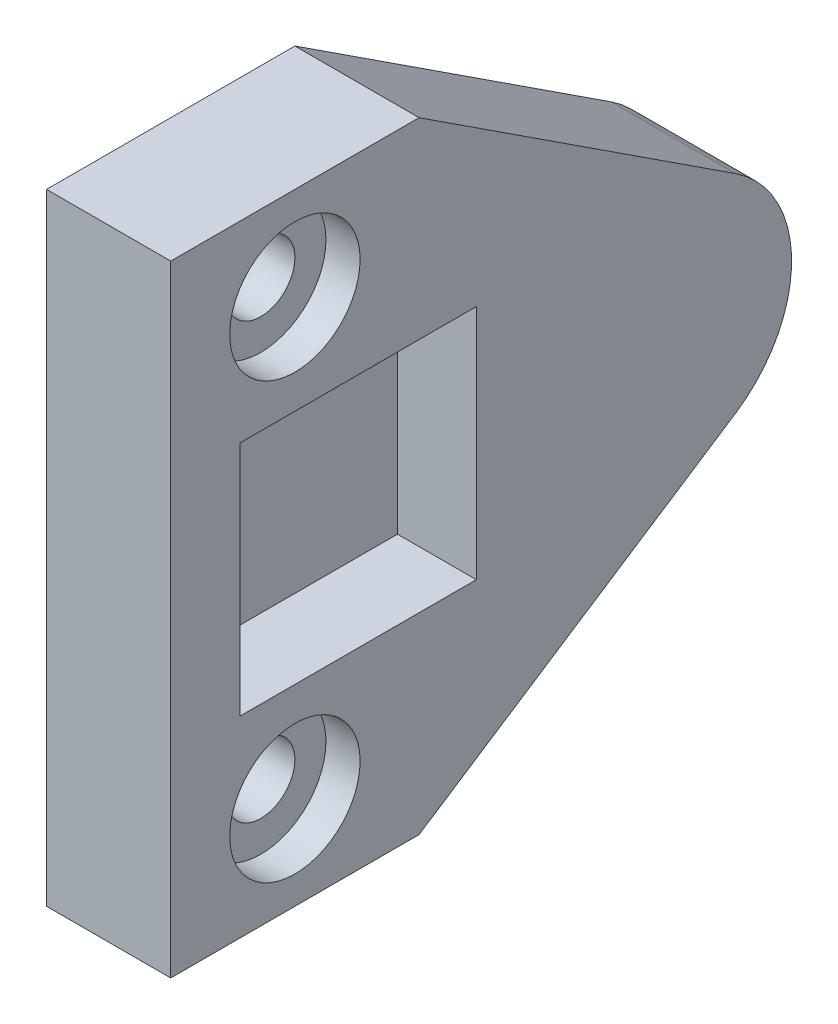
ISO-10303-21;
HEADER;
FILE_DESCRIPTION(('STEP AP214'),'2;1');
FILE_NAME('part.step','',(''),(''),'','','');
FILE_SCHEMA(('AUTOMOTIVE_DESIGN { 1 0 10303 214 1 1 1 1 }'));
ENDSEC;
DATA;
#1=APPLICATION_CONTEXT('core data for automotive mechanical design processes');
#2=APPLICATION_PROTOCOL_DEFINITION('international standard','automotive_design',2000,#1);
#3=PRODUCT_CONTEXT('',#1,'mechanical');
#4=PRODUCT('Part','Part','',(#3));
#5=PRODUCT_RELATED_PRODUCT_CATEGORY('part','',(#4));
#6=PRODUCT_DEFINITION_FORMATION('','',#4);
#7=PRODUCT_DEFINITION_CONTEXT('part definition',#1,'design');
#8=PRODUCT_DEFINITION('design','',#6,#7);
#9=PRODUCT_DEFINITION_SHAPE('','',#8);
#10=(LENGTH_UNIT() NAMED_UNIT(*) SI_UNIT(.MILLI.,.METRE.));
#11=(NAMED_UNIT(*) PLANE_ANGLE_UNIT() SI_UNIT($,.RADIAN.));
#12=(NAMED_UNIT(*) SI_UNIT($,.STERADIAN.) SOLID_ANGLE_UNIT());
#13=UNCERTAINTY_MEASURE_WITH_UNIT(LENGTH_MEASURE(1.E-05),#10,'distance_accuracy_value','');
#14=(GEOMETRIC_REPRESENTATION_CONTEXT(3) GLOBAL_UNCERTAINTY_ASSIGNED_CONTEXT((#13)) GLOBAL_UNIT_ASSIGNED_CONTEXT((#10,
#11,#12)) REPRESENTATION_CONTEXT('',''));
#15=CARTESIAN_POINT('',(0.,0.,0.));
#16=DIRECTION('',(0.,0.,1.));
#17=DIRECTION('',(1.,0.,0.));
#18=AXIS2_PLACEMENT_3D('',#15,#16,#17);
#19=CARTESIAN_POINT('',(10.,-25.,0.));
#20=DIRECTION('',(0.,1.,0.));
#21=DIRECTION('',(0.,0.,1.));
#22=AXIS2_PLACEMENT_3D('',#19,#20,#21);
#23=PLANE('',#22);
#24=DIRECTION('',(0.,0.,-1.));
#25=VECTOR('',#24,1.);
#26=CARTESIAN_POINT('',(0.,-25.,0.));
#27=LINE('',#26,#25);
#28=CARTESIAN_POINT('',(0.,-25.,20.));
#29=VERTEX_POINT('',#28);
#30=CARTESIAN_POINT('',(0.,-25.,0.));
#31=VERTEX_POINT('',#30);
#32=EDGE_CURVE('E130',#29,#31,#27,.T.);
#33=ORIENTED_EDGE('',*,*,#32,.T.);
#34=DIRECTION('',(-1.,0.,0.));
#35=VECTOR('',#34,1.);
#36=CARTESIAN_POINT('',(10.,-25.,0.));
#37=LINE('',#36,#35);
#38=CARTESIAN_POINT('',(10.,-25.,0.));
#39=VERTEX_POINT('',#38);
#40=EDGE_CURVE('E11',#39,#31,#37,.T.);
#41=ORIENTED_EDGE('',*,*,#40,.F.);
#42=DIRECTION('',(0.,0.,-1.));
#43=VECTOR('',#42,1.);
#44=CARTESIAN_POINT('',(10.,-25.,0.));
#45=LINE('',#44,#43);
#46=CARTESIAN_POINT('',(10.,-25.,20.));
#47=VERTEX_POINT('',#46);
#48=EDGE_CURVE('E90',#47,#39,#45,.T.);
#49=ORIENTED_EDGE('',*,*,#48,.F.);
#50=DIRECTION('',(-1.,0.,0.));
#51=VECTOR('',#50,1.);
#52=CARTESIAN_POINT('',(10.,-25.,20.));
#53=LINE('',#52,#51);
#54=EDGE_CURVE('E58',#47,#29,#53,.T.);
#55=ORIENTED_EDGE('',*,*,#54,.T.);
#56=EDGE_LOOP('',(#33,#41,#49,#55));
#57=FACE_BOUND('',#56,.T.);
#58=ADVANCED_FACE('F35',(#57),#23,.F.);
#59=CARTESIAN_POINT('',(10.,-17.5285693400336,-11.4439281015076));
#60=DIRECTION('',(0.,-0.837342685882753,-0.546678357353442));
#61=DIRECTION('',(0.,0.546678357353442,-0.837342685882753));
#62=AXIS2_PLACEMENT_3D('',#59,#60,#61);
#63=PLANE('',#62);
#64=DIRECTION('',(0.,-0.546678357353442,0.837342685882753));
#65=VECTOR('',#64,1.);
#66=CARTESIAN_POINT('',(0.,-17.5285693400336,-11.4439281015076));
#67=LINE('',#66,#65);
#68=CARTESIAN_POINT('',(0.,-8.37342685882754,-25.4667835735344));
#69=VERTEX_POINT('',#68);
#70=EDGE_CURVE('E132',#69,#31,#67,.T.);
#71=ORIENTED_EDGE('',*,*,#70,.F.);
#72=DIRECTION('',(-1.,0.,0.));
#73=VECTOR('',#72,1.);
#74=CARTESIAN_POINT('',(10.,-8.37342685882754,-25.4667835735344));
#75=LINE('',#74,#73);
#76=CARTESIAN_POINT('',(10.,-8.37342685882754,-25.4667835735344));
#77=VERTEX_POINT('',#76);
#78=EDGE_CURVE('E42',#77,#69,#75,.T.);
#79=ORIENTED_EDGE('',*,*,#78,.F.);
#80=DIRECTION('',(0.,-0.546678357353442,0.837342685882753));
#81=VECTOR('',#80,1.);
#82=CARTESIAN_POINT('',(10.,-17.5285693400336,-11.4439281015076));
#83=LINE('',#82,#81);
#84=EDGE_CURVE('E171',#77,#39,#83,.T.);
#85=ORIENTED_EDGE('',*,*,#84,.T.);
#86=ORIENTED_EDGE('',*,*,#40,.T.);
#87=EDGE_LOOP('',(#71,#79,#85,#86));
#88=FACE_BOUND('',#87,.T.);
#89=ADVANCED_FACE('F153',(#88),#63,.T.);
#90=CARTESIAN_POINT('',(10.,0.,-20.));
#91=DIRECTION('',(-1.,0.,0.));
#92=DIRECTION('',(0.,0.,1.));
#93=AXIS2_PLACEMENT_3D('',#90,#91,#92);
#94=CYLINDRICAL_SURFACE('',#93,10.);
#95=CARTESIAN_POINT('',(0.,0.,-20.));
#96=DIRECTION('',(1.,0.,0.));
#97=DIRECTION('',(0.,0.,-1.));
#98=AXIS2_PLACEMENT_3D('',#95,#96,#97);
#99=CIRCLE('',#98,10.);
#100=CARTESIAN_POINT('',(0.,8.37342685882754,-25.4667835735344));
#101=VERTEX_POINT('',#100);
#102=EDGE_CURVE('E136',#101,#69,#99,.F.);
#103=ORIENTED_EDGE('',*,*,#102,.F.);
#104=DIRECTION('',(-1.,0.,0.));
#105=VECTOR('',#104,1.);
#106=CARTESIAN_POINT('',(10.,8.37342685882754,-25.4667835735344));
#107=LINE('',#106,#105);
#108=CARTESIAN_POINT('',(10.,8.37342685882754,-25.4667835735344));
#109=VERTEX_POINT('',#108);
#110=EDGE_CURVE('E114',#109,#101,#107,.T.);
#111=ORIENTED_EDGE('',*,*,#110,.F.);
#112=CARTESIAN_POINT('',(10.,0.,-20.));
#113=DIRECTION('',(1.,0.,0.));
#114=DIRECTION('',(0.,0.,-1.));
#115=AXIS2_PLACEMENT_3D('',#112,#113,#114);
#116=CIRCLE('',#115,10.);
#117=EDGE_CURVE('E122',#109,#77,#116,.F.);
#118=ORIENTED_EDGE('',*,*,#117,.T.);
#119=ORIENTED_EDGE('',*,*,#78,.T.);
#120=EDGE_LOOP('',(#103,#111,#118,#119));
#121=FACE_BOUND('',#120,.T.);
#122=ADVANCED_FACE('F150',(#121),#94,.T.);
#123=CARTESIAN_POINT('',(10.,17.5285693400336,-11.4439281015076));
#124=DIRECTION('',(0.,0.837342685882753,-0.546678357353442));
#125=DIRECTION('',(0.,0.546678357353442,0.837342685882753));
#126=AXIS2_PLACEMENT_3D('',#123,#124,#125);
#127=PLANE('',#126);
#128=DIRECTION('',(0.,-0.546678357353442,-0.837342685882753));
#129=VECTOR('',#128,1.);
#130=CARTESIAN_POINT('',(0.,17.5285693400336,-11.4439281015076));
#131=LINE('',#130,#129);
#132=CARTESIAN_POINT('',(0.,25.,0.));
#133=VERTEX_POINT('',#132);
#134=EDGE_CURVE('E109',#133,#101,#131,.T.);
#135=ORIENTED_EDGE('',*,*,#134,.F.);
#136=DIRECTION('',(-1.,0.,0.));
#137=VECTOR('',#136,1.);
#138=CARTESIAN_POINT('',(10.,25.,0.));
#139=LINE('',#138,#137);
#140=CARTESIAN_POINT('',(10.,25.,0.));
#141=VERTEX_POINT('',#140);
#142=EDGE_CURVE('E104',#141,#133,#139,.T.);
#143=ORIENTED_EDGE('',*,*,#142,.F.);
#144=DIRECTION('',(0.,-0.546678357353442,-0.837342685882753));
#145=VECTOR('',#144,1.);
#146=CARTESIAN_POINT('',(10.,17.5285693400336,-11.4439281015076));
#147=LINE('',#146,#145);
#148=EDGE_CURVE('E107',#141,#109,#147,.T.);
#149=ORIENTED_EDGE('',*,*,#148,.T.);
#150=ORIENTED_EDGE('',*,*,#110,.T.);
#151=EDGE_LOOP('',(#135,#143,#149,#150));
#152=FACE_BOUND('',#151,.T.);
#153=ADVANCED_FACE('F106',(#152),#127,.T.);
#154=CARTESIAN_POINT('',(10.,25.,0.));
#155=DIRECTION('',(0.,1.,0.));
#156=DIRECTION('',(0.,0.,1.));
#157=AXIS2_PLACEMENT_3D('',#154,#155,#156);
#158=PLANE('',#157);
#159=DIRECTION('',(0.,0.,-1.));
#160=VECTOR('',#159,1.);
#161=CARTESIAN_POINT('',(0.,25.,0.));
#162=LINE('',#161,#160);
#163=CARTESIAN_POINT('',(0.,25.,20.));
#164=VERTEX_POINT('',#163);
#165=EDGE_CURVE('E140',#164,#133,#162,.T.);
#166=ORIENTED_EDGE('',*,*,#165,.F.);
#167=DIRECTION('',(-1.,0.,0.));
#168=VECTOR('',#167,1.);
#169=CARTESIAN_POINT('',(10.,25.,20.));
#170=LINE('',#169,#168);
#171=CARTESIAN_POINT('',(10.,25.,20.));
#172=VERTEX_POINT('',#171);
#173=EDGE_CURVE('E115',#172,#164,#170,.T.);
#174=ORIENTED_EDGE('',*,*,#173,.F.);
#175=DIRECTION('',(0.,0.,-1.));
#176=VECTOR('',#175,1.);
#177=CARTESIAN_POINT('',(10.,25.,0.));
#178=LINE('',#177,#176);
#179=EDGE_CURVE('E120',#172,#141,#178,.T.);
#180=ORIENTED_EDGE('',*,*,#179,.T.);
#181=ORIENTED_EDGE('',*,*,#142,.T.);
#182=EDGE_LOOP('',(#166,#174,#180,#181));
#183=FACE_BOUND('',#182,.T.);
#184=ADVANCED_FACE('F124',(#183),#158,.T.);
#185=CARTESIAN_POINT('',(10.,0.,20.));
#186=DIRECTION('',(0.,0.,1.));
#187=DIRECTION('',(1.,0.,0.));
#188=AXIS2_PLACEMENT_3D('',#185,#186,#187);
#189=PLANE('',#188);
#190=DIRECTION('',(0.,1.,0.));
#191=VECTOR('',#190,1.);
#192=CARTESIAN_POINT('',(0.,0.,20.));
#193=LINE('',#192,#191);
#194=EDGE_CURVE('E142',#29,#164,#193,.T.);
#195=ORIENTED_EDGE('',*,*,#194,.F.);
#196=ORIENTED_EDGE('',*,*,#54,.F.);
#197=DIRECTION('',(0.,1.,0.));
#198=VECTOR('',#197,1.);
#199=CARTESIAN_POINT('',(10.,0.,20.));
#200=LINE('',#199,#198);
#201=EDGE_CURVE('E125',#47,#172,#200,.T.);
#202=ORIENTED_EDGE('',*,*,#201,.T.);
#203=ORIENTED_EDGE('',*,*,#173,.T.);
#204=EDGE_LOOP('',(#195,#196,#202,#203));
#205=FACE_BOUND('',#204,.T.);
#206=ADVANCED_FACE('F156',(#205),#189,.T.);
#207=CARTESIAN_POINT('',(10.,0.,0.));
#208=DIRECTION('',(1.,0.,0.));
#209=DIRECTION('',(0.,0.,-1.));
#210=AXIS2_PLACEMENT_3D('',#207,#208,#209);
#211=PLANE('',#210);
#212=DIRECTION('',(0.,-1.,0.));
#213=VECTOR('',#212,1.);
#214=CARTESIAN_POINT('',(10.,9.525,14.4405658787244));
#215=LINE('',#214,#213);
#216=CARTESIAN_POINT('',(10.,9.525,14.4405658787244));
#217=VERTEX_POINT('',#216);
#218=CARTESIAN_POINT('',(10.,-9.525,14.4405658787244));
#219=VERTEX_POINT('',#218);
#220=EDGE_CURVE('E49',#217,#219,#215,.T.);
#221=ORIENTED_EDGE('',*,*,#220,.F.);
#222=DIRECTION('',(0.,0.,1.));
#223=VECTOR('',#222,1.);
#224=CARTESIAN_POINT('',(10.,9.525,14.4405658787244));
#225=LINE('',#224,#223);
#226=CARTESIAN_POINT('',(10.,9.525,-4.6094341212756));
#227=VERTEX_POINT('',#226);
#228=EDGE_CURVE('E209',#227,#217,#225,.T.);
#229=ORIENTED_EDGE('',*,*,#228,.F.);
#230=DIRECTION('',(0.,1.,0.));
#231=VECTOR('',#230,1.);
#232=CARTESIAN_POINT('',(10.,9.525,-4.6094341212756));
#233=LINE('',#232,#231);
#234=CARTESIAN_POINT('',(10.,-9.525,-4.6094341212756));
#235=VERTEX_POINT('',#234);
#236=EDGE_CURVE('E213',#235,#227,#233,.T.);
#237=ORIENTED_EDGE('',*,*,#236,.F.);
#238=DIRECTION('',(0.,0.,-1.));
#239=VECTOR('',#238,1.);
#240=CARTESIAN_POINT('',(10.,-9.525,14.4405658787244));
#241=LINE('',#240,#239);
#242=EDGE_CURVE('E216',#219,#235,#241,.T.);
#243=ORIENTED_EDGE('',*,*,#242,.F.);
#244=EDGE_LOOP('',(#221,#229,#237,#243));
#245=FACE_BOUND('',#244,.T.);
#246=CARTESIAN_POINT('',(10.,17.5,9.99999999999999));
#247=DIRECTION('',(1.,0.,0.));
#248=DIRECTION('',(0.,0.,-1.));
#249=AXIS2_PLACEMENT_3D('',#246,#247,#248);
#250=CIRCLE('',#249,5.25);
#251=CARTESIAN_POINT('',(10.,17.5,4.74999999999999));
#252=VERTEX_POINT('',#251);
#253=EDGE_CURVE('E195',#252,#252,#250,.T.);
#254=ORIENTED_EDGE('',*,*,#253,.F.);
#255=EDGE_LOOP('',(#254));
#256=FACE_BOUND('',#255,.T.);
#257=CARTESIAN_POINT('',(10.,-17.5,9.99999999999999));
#258=DIRECTION('',(1.,0.,0.));
#259=DIRECTION('',(0.,0.,-1.));
#260=AXIS2_PLACEMENT_3D('',#257,#258,#259);
#261=CIRCLE('',#260,5.25);
#262=CARTESIAN_POINT('',(10.,-17.5,4.74999999999999));
#263=VERTEX_POINT('',#262);
#264=EDGE_CURVE('E183',#263,#263,#261,.T.);
#265=ORIENTED_EDGE('',*,*,#264,.F.);
#266=EDGE_LOOP('',(#265));
#267=FACE_BOUND('',#266,.T.);
#268=ORIENTED_EDGE('',*,*,#48,.T.);
#269=ORIENTED_EDGE('',*,*,#84,.F.);
#270=ORIENTED_EDGE('',*,*,#117,.F.);
#271=ORIENTED_EDGE('',*,*,#148,.F.);
#272=ORIENTED_EDGE('',*,*,#179,.F.);
#273=ORIENTED_EDGE('',*,*,#201,.F.);
#274=EDGE_LOOP('',(#268,#269,#270,#271,#272,#273));
#275=FACE_BOUND('',#274,.T.);
#276=ADVANCED_FACE('F119',(#245,#256,#267,#275),#211,.T.);
#277=CARTESIAN_POINT('',(0.,0.,0.));
#278=DIRECTION('',(1.,0.,0.));
#279=DIRECTION('',(0.,0.,-1.));
#280=AXIS2_PLACEMENT_3D('',#277,#278,#279);
#281=PLANE('',#280);
#282=CARTESIAN_POINT('',(0.,17.5,9.99999999999999));
#283=DIRECTION('',(1.,0.,0.));
#284=DIRECTION('',(0.,0.,-1.));
#285=AXIS2_PLACEMENT_3D('',#282,#283,#284);
#286=CIRCLE('',#285,2.75);
#287=CARTESIAN_POINT('',(0.,17.5,7.24999999999999));
#288=VERTEX_POINT('',#287);
#289=EDGE_CURVE('E186',#288,#288,#286,.T.);
#290=ORIENTED_EDGE('',*,*,#289,.T.);
#291=EDGE_LOOP('',(#290));
#292=FACE_BOUND('',#291,.T.);
#293=CARTESIAN_POINT('',(0.,-17.5,9.99999999999999));
#294=DIRECTION('',(1.,0.,0.));
#295=DIRECTION('',(0.,0.,-1.));
#296=AXIS2_PLACEMENT_3D('',#293,#294,#295);
#297=CIRCLE('',#296,2.75);
#298=CARTESIAN_POINT('',(0.,-17.5,7.25));
#299=VERTEX_POINT('',#298);
#300=EDGE_CURVE('E133',#299,#299,#297,.T.);
#301=ORIENTED_EDGE('',*,*,#300,.T.);
#302=EDGE_LOOP('',(#301));
#303=FACE_BOUND('',#302,.T.);
#304=ORIENTED_EDGE('',*,*,#32,.F.);
#305=ORIENTED_EDGE('',*,*,#194,.T.);
#306=ORIENTED_EDGE('',*,*,#165,.T.);
#307=ORIENTED_EDGE('',*,*,#134,.T.);
#308=ORIENTED_EDGE('',*,*,#102,.T.);
#309=ORIENTED_EDGE('',*,*,#70,.T.);
#310=EDGE_LOOP('',(#304,#305,#306,#307,#308,#309));
#311=FACE_BOUND('',#310,.T.);
#312=ADVANCED_FACE('F155',(#292,#303,#311),#281,.F.);
#313=CARTESIAN_POINT('',(10.,-17.5,9.99999999999999));
#314=DIRECTION('',(1.,0.,0.));
#315=DIRECTION('',(0.,0.,-1.));
#316=AXIS2_PLACEMENT_3D('',#313,#314,#315);
#317=CYLINDRICAL_SURFACE('',#316,2.75);
#318=ORIENTED_EDGE('',*,*,#300,.F.);
#319=EDGE_LOOP('',(#318));
#320=FACE_BOUND('',#319,.T.);
#321=CARTESIAN_POINT('',(7.25,-17.5,9.99999999999999));
#322=DIRECTION('',(1.,0.,0.));
#323=DIRECTION('',(0.,0.,-1.));
#324=AXIS2_PLACEMENT_3D('',#321,#322,#323);
#325=CIRCLE('',#324,2.75);
#326=CARTESIAN_POINT('',(7.25,-17.5,7.24999999999999));
#327=VERTEX_POINT('',#326);
#328=EDGE_CURVE('E177',#327,#327,#325,.T.);
#329=ORIENTED_EDGE('',*,*,#328,.T.);
#330=EDGE_LOOP('',(#329));
#331=FACE_BOUND('',#330,.T.);
#332=ADVANCED_FACE('F290',(#320,#331),#317,.F.);
#333=CARTESIAN_POINT('',(7.25,-14.75,9.99999999999999));
#334=DIRECTION('',(-1.,0.,0.));
#335=DIRECTION('',(0.,0.,1.));
#336=AXIS2_PLACEMENT_3D('',#333,#334,#335);
#337=PLANE('',#336);
#338=ORIENTED_EDGE('',*,*,#328,.F.);
#339=EDGE_LOOP('',(#338));
#340=FACE_BOUND('',#339,.T.);
#341=CARTESIAN_POINT('',(7.25,-17.5,9.99999999999999));
#342=DIRECTION('',(1.,0.,0.));
#343=DIRECTION('',(0.,0.,-1.));
#344=AXIS2_PLACEMENT_3D('',#341,#342,#343);
#345=CIRCLE('',#344,5.25);
#346=CARTESIAN_POINT('',(7.25,-17.5,4.74999999999999));
#347=VERTEX_POINT('',#346);
#348=EDGE_CURVE('E180',#347,#347,#345,.T.);
#349=ORIENTED_EDGE('',*,*,#348,.T.);
#350=EDGE_LOOP('',(#349));
#351=FACE_BOUND('',#350,.T.);
#352=ADVANCED_FACE('F286',(#340,#351),#337,.F.);
#353=CARTESIAN_POINT('',(10.,-17.5,9.99999999999999));
#354=DIRECTION('',(1.,0.,0.));
#355=DIRECTION('',(0.,0.,-1.));
#356=AXIS2_PLACEMENT_3D('',#353,#354,#355);
#357=CYLINDRICAL_SURFACE('',#356,5.25);
#358=ORIENTED_EDGE('',*,*,#348,.F.);
#359=EDGE_LOOP('',(#358));
#360=FACE_BOUND('',#359,.T.);
#361=ORIENTED_EDGE('',*,*,#264,.T.);
#362=EDGE_LOOP('',(#361));
#363=FACE_BOUND('',#362,.T.);
#364=ADVANCED_FACE('F282',(#360,#363),#357,.F.);
#365=CARTESIAN_POINT('',(10.,17.5,9.99999999999999));
#366=DIRECTION('',(1.,0.,0.));
#367=DIRECTION('',(0.,0.,-1.));
#368=AXIS2_PLACEMENT_3D('',#365,#366,#367);
#369=CYLINDRICAL_SURFACE('',#368,2.75);
#370=ORIENTED_EDGE('',*,*,#289,.F.);
#371=EDGE_LOOP('',(#370));
#372=FACE_BOUND('',#371,.T.);
#373=CARTESIAN_POINT('',(7.25,17.5,9.99999999999999));
#374=DIRECTION('',(1.,0.,0.));
#375=DIRECTION('',(0.,0.,-1.));
#376=AXIS2_PLACEMENT_3D('',#373,#374,#375);
#377=CIRCLE('',#376,2.75);
#378=CARTESIAN_POINT('',(7.25,17.5,7.24999999999999));
#379=VERTEX_POINT('',#378);
#380=EDGE_CURVE('E189',#379,#379,#377,.T.);
#381=ORIENTED_EDGE('',*,*,#380,.T.);
#382=EDGE_LOOP('',(#381));
#383=FACE_BOUND('',#382,.T.);
#384=ADVANCED_FACE('F278',(#372,#383),#369,.F.);
#385=CARTESIAN_POINT('',(7.25,20.25,9.99999999999999));
#386=DIRECTION('',(-1.,0.,0.));
#387=DIRECTION('',(0.,0.,1.));
#388=AXIS2_PLACEMENT_3D('',#385,#386,#387);
#389=PLANE('',#388);
#390=ORIENTED_EDGE('',*,*,#380,.F.);
#391=EDGE_LOOP('',(#390));
#392=FACE_BOUND('',#391,.T.);
#393=CARTESIAN_POINT('',(7.25,17.5,9.99999999999999));
#394=DIRECTION('',(1.,0.,0.));
#395=DIRECTION('',(0.,0.,-1.));
#396=AXIS2_PLACEMENT_3D('',#393,#394,#395);
#397=CIRCLE('',#396,5.25);
#398=CARTESIAN_POINT('',(7.25,17.5,4.75));
#399=VERTEX_POINT('',#398);
#400=EDGE_CURVE('E192',#399,#399,#397,.T.);
#401=ORIENTED_EDGE('',*,*,#400,.T.);
#402=EDGE_LOOP('',(#401));
#403=FACE_BOUND('',#402,.T.);
#404=ADVANCED_FACE('F274',(#392,#403),#389,.F.);
#405=CARTESIAN_POINT('',(10.,17.5,9.99999999999999));
#406=DIRECTION('',(1.,0.,0.));
#407=DIRECTION('',(0.,0.,-1.));
#408=AXIS2_PLACEMENT_3D('',#405,#406,#407);
#409=CYLINDRICAL_SURFACE('',#408,5.25);
#410=ORIENTED_EDGE('',*,*,#400,.F.);
#411=EDGE_LOOP('',(#410));
#412=FACE_BOUND('',#411,.T.);
#413=ORIENTED_EDGE('',*,*,#253,.T.);
#414=EDGE_LOOP('',(#413));
#415=FACE_BOUND('',#414,.T.);
#416=ADVANCED_FACE('F271',(#412,#415),#409,.F.);
#417=CARTESIAN_POINT('',(3.65,9.525,14.4405658787244));
#418=DIRECTION('',(0.,0.,1.));
#419=DIRECTION('',(1.,0.,0.));
#420=AXIS2_PLACEMENT_3D('',#417,#418,#419);
#421=PLANE('',#420);
#422=ORIENTED_EDGE('',*,*,#220,.T.);
#423=DIRECTION('',(1.,0.,0.));
#424=VECTOR('',#423,1.);
#425=CARTESIAN_POINT('',(3.65,-9.525,14.4405658787244));
#426=LINE('',#425,#424);
#427=CARTESIAN_POINT('',(3.65,-9.525,14.4405658787244));
#428=VERTEX_POINT('',#427);
#429=EDGE_CURVE('E199',#428,#219,#426,.T.);
#430=ORIENTED_EDGE('',*,*,#429,.F.);
#431=DIRECTION('',(0.,-1.,0.));
#432=VECTOR('',#431,1.);
#433=CARTESIAN_POINT('',(3.65,9.525,14.4405658787244));
#434=LINE('',#433,#432);
#435=CARTESIAN_POINT('',(3.65,9.525,14.4405658787244));
#436=VERTEX_POINT('',#435);
#437=EDGE_CURVE('E212',#436,#428,#434,.T.);
#438=ORIENTED_EDGE('',*,*,#437,.F.);
#439=DIRECTION('',(1.,0.,0.));
#440=VECTOR('',#439,1.);
#441=CARTESIAN_POINT('',(3.65,9.525,14.4405658787244));
#442=LINE('',#441,#440);
#443=EDGE_CURVE('E198',#436,#217,#442,.T.);
#444=ORIENTED_EDGE('',*,*,#443,.T.);
#445=EDGE_LOOP('',(#422,#430,#438,#444));
#446=FACE_BOUND('',#445,.T.);
#447=ADVANCED_FACE('F237',(#446),#421,.F.);
#448=CARTESIAN_POINT('',(3.65,9.525,14.4405658787244));
#449=DIRECTION('',(0.,1.,0.));
#450=DIRECTION('',(0.,0.,1.));
#451=AXIS2_PLACEMENT_3D('',#448,#449,#450);
#452=PLANE('',#451);
#453=ORIENTED_EDGE('',*,*,#228,.T.);
#454=ORIENTED_EDGE('',*,*,#443,.F.);
#455=DIRECTION('',(0.,0.,1.));
#456=VECTOR('',#455,1.);
#457=CARTESIAN_POINT('',(3.65,9.525,14.4405658787244));
#458=LINE('',#457,#456);
#459=CARTESIAN_POINT('',(3.65,9.525,-4.6094341212756));
#460=VERTEX_POINT('',#459);
#461=EDGE_CURVE('E202',#460,#436,#458,.T.);
#462=ORIENTED_EDGE('',*,*,#461,.F.);
#463=DIRECTION('',(1.,0.,0.));
#464=VECTOR('',#463,1.);
#465=CARTESIAN_POINT('',(3.65,9.525,-4.6094341212756));
#466=LINE('',#465,#464);
#467=EDGE_CURVE('E205',#460,#227,#466,.T.);
#468=ORIENTED_EDGE('',*,*,#467,.T.);
#469=EDGE_LOOP('',(#453,#454,#462,#468));
#470=FACE_BOUND('',#469,.T.);
#471=ADVANCED_FACE('F248',(#470),#452,.F.);
#472=CARTESIAN_POINT('',(3.65,9.525,-4.6094341212756));
#473=DIRECTION('',(0.,0.,-1.));
#474=DIRECTION('',(-1.,0.,0.));
#475=AXIS2_PLACEMENT_3D('',#472,#473,#474);
#476=PLANE('',#475);
#477=ORIENTED_EDGE('',*,*,#236,.T.);
#478=ORIENTED_EDGE('',*,*,#467,.F.);
#479=DIRECTION('',(0.,1.,0.));
#480=VECTOR('',#479,1.);
#481=CARTESIAN_POINT('',(3.65,9.525,-4.6094341212756));
#482=LINE('',#481,#480);
#483=CARTESIAN_POINT('',(3.65,-9.525,-4.6094341212756));
#484=VERTEX_POINT('',#483);
#485=EDGE_CURVE('E222',#484,#460,#482,.T.);
#486=ORIENTED_EDGE('',*,*,#485,.F.);
#487=DIRECTION('',(1.,0.,0.));
#488=VECTOR('',#487,1.);
#489=CARTESIAN_POINT('',(3.65,-9.525,-4.6094341212756));
#490=LINE('',#489,#488);
#491=EDGE_CURVE('E201',#484,#235,#490,.T.);
#492=ORIENTED_EDGE('',*,*,#491,.T.);
#493=EDGE_LOOP('',(#477,#478,#486,#492));
#494=FACE_BOUND('',#493,.T.);
#495=ADVANCED_FACE('F253',(#494),#476,.F.);
#496=CARTESIAN_POINT('',(3.65,-9.525,14.4405658787244));
#497=DIRECTION('',(0.,-1.,0.));
#498=DIRECTION('',(0.,0.,-1.));
#499=AXIS2_PLACEMENT_3D('',#496,#497,#498);
#500=PLANE('',#499);
#501=ORIENTED_EDGE('',*,*,#242,.T.);
#502=ORIENTED_EDGE('',*,*,#491,.F.);
#503=DIRECTION('',(0.,0.,-1.));
#504=VECTOR('',#503,1.);
#505=CARTESIAN_POINT('',(3.65,-9.525,14.4405658787244));
#506=LINE('',#505,#504);
#507=EDGE_CURVE('E225',#428,#484,#506,.T.);
#508=ORIENTED_EDGE('',*,*,#507,.F.);
#509=ORIENTED_EDGE('',*,*,#429,.T.);
#510=EDGE_LOOP('',(#501,#502,#508,#509));
#511=FACE_BOUND('',#510,.T.);
#512=ADVANCED_FACE('F258',(#511),#500,.F.);
#513=CARTESIAN_POINT('',(3.65,0.,0.));
#514=DIRECTION('',(1.,0.,0.));
#515=DIRECTION('',(0.,0.,-1.));
#516=AXIS2_PLACEMENT_3D('',#513,#514,#515);
#517=PLANE('',#516);
#518=ORIENTED_EDGE('',*,*,#437,.T.);
#519=ORIENTED_EDGE('',*,*,#507,.T.);
#520=ORIENTED_EDGE('',*,*,#485,.T.);
#521=ORIENTED_EDGE('',*,*,#461,.T.);
#522=EDGE_LOOP('',(#518,#519,#520,#521));
#523=FACE_BOUND('',#522,.T.);
#524=ADVANCED_FACE('F232',(#523),#517,.T.);
#525=CLOSED_SHELL('',(#58,#89,#122,#153,#184,#206,#276,#312,#332,#352,#364,#384,#404,#416,#447,
#471,#495,#512,#524));
#526=MANIFOLD_SOLID_BREP('B2',#525);
#527=ADVANCED_BREP_SHAPE_REPRESENTATION('',(#18,#526),#14);
#528=SHAPE_DEFINITION_REPRESENTATION(#9,#527);
ENDSEC;
END-ISO-10303-21;
